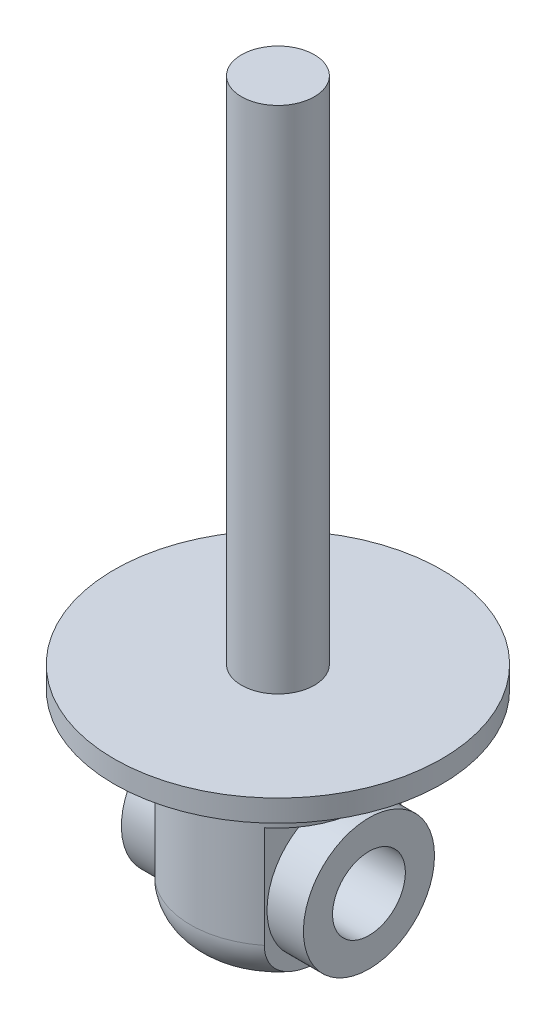
ISO-10303-21;
HEADER;
FILE_DESCRIPTION(('STEP AP214'),'2;1');
FILE_NAME('part.step','',(''),(''),'','','');
FILE_SCHEMA(('AUTOMOTIVE_DESIGN { 1 0 10303 214 1 1 1 1 }'));
ENDSEC;
DATA;
#1=APPLICATION_CONTEXT('core data for automotive mechanical design processes');
#2=APPLICATION_PROTOCOL_DEFINITION('international standard','automotive_design',2000,#1);
#3=PRODUCT_CONTEXT('',#1,'mechanical');
#4=PRODUCT('Part','Part','',(#3));
#5=PRODUCT_RELATED_PRODUCT_CATEGORY('part','',(#4));
#6=PRODUCT_DEFINITION_FORMATION('','',#4);
#7=PRODUCT_DEFINITION_CONTEXT('part definition',#1,'design');
#8=PRODUCT_DEFINITION('design','',#6,#7);
#9=PRODUCT_DEFINITION_SHAPE('','',#8);
#10=(LENGTH_UNIT() NAMED_UNIT(*) SI_UNIT(.MILLI.,.METRE.));
#11=(NAMED_UNIT(*) PLANE_ANGLE_UNIT() SI_UNIT($,.RADIAN.));
#12=(NAMED_UNIT(*) SI_UNIT($,.STERADIAN.) SOLID_ANGLE_UNIT());
#13=UNCERTAINTY_MEASURE_WITH_UNIT(LENGTH_MEASURE(1.E-05),#10,'distance_accuracy_value','');
#14=(GEOMETRIC_REPRESENTATION_CONTEXT(3) GLOBAL_UNCERTAINTY_ASSIGNED_CONTEXT((#13)) GLOBAL_UNIT_ASSIGNED_CONTEXT((#10,
#11,#12)) REPRESENTATION_CONTEXT('',''));
#15=CARTESIAN_POINT('',(0.,0.,0.));
#16=DIRECTION('',(0.,0.,1.));
#17=DIRECTION('',(1.,0.,0.));
#18=AXIS2_PLACEMENT_3D('',#15,#16,#17);
#19=CARTESIAN_POINT('',(-7.5,-8.00000000000001,-22.5));
#20=DIRECTION('',(1.,0.,0.));
#21=DIRECTION('',(0.,1.,0.));
#22=AXIS2_PLACEMENT_3D('',#19,#20,#21);
#23=PLANE('',#22);
#24=CARTESIAN_POINT('',(-7.5,-27.8094750193111,0.));
#25=CARTESIAN_POINT('',(-7.5,-27.8094752958151,0.184521628242419));
#26=CARTESIAN_POINT('',(-7.5,-27.8077270322999,0.369043480287191));
#27=CARTESIAN_POINT('',(-7.5,-27.8006130628877,0.737999394292284));
#28=CARTESIAN_POINT('',(-7.5,-27.7952477367066,0.922433463434384));
#29=CARTESIAN_POINT('',(-7.5,-27.780538513706,1.29122559425462));
#30=CARTESIAN_POINT('',(-7.5,-27.7711929215574,1.47558358999919));
#31=CARTESIAN_POINT('',(-7.5,-27.7479507640883,1.84401846668315));
#32=CARTESIAN_POINT('',(-7.5,-27.734054140347,2.02809534398339));
#33=CARTESIAN_POINT('',(-7.5,-27.701027325669,2.39498843631837));
#34=CARTESIAN_POINT('',(-7.5,-27.6819201299087,2.57780665418326));
#35=CARTESIAN_POINT('',(-7.5,-27.6375682217561,2.94269408038083));
#36=CARTESIAN_POINT('',(-7.5,-27.6123230495969,3.12476323156505));
#37=CARTESIAN_POINT('',(-7.5,-27.5259360262262,3.6691632505479));
#38=CARTESIAN_POINT('',(-7.5,-27.4541196223952,4.02997739530099));
#39=CARTESIAN_POINT('',(-7.5,-27.315114172541,4.57935988961709));
#40=CARTESIAN_POINT('',(-7.5,-27.2608348848703,4.77122256452969));
#41=CARTESIAN_POINT('',(-7.5,-27.1402411036094,5.15109529504942));
#42=CARTESIAN_POINT('',(-7.5,-27.0739312594077,5.33910680786539));
#43=CARTESIAN_POINT('',(-7.5,-26.928148698992,5.70992505463463));
#44=CARTESIAN_POINT('',(-7.5,-26.8486797977089,5.8927332791208));
#45=CARTESIAN_POINT('',(-7.5,-26.6756224712841,6.25155879665883));
#46=CARTESIAN_POINT('',(-7.5,-26.5820364486502,6.42757723883459));
#47=CARTESIAN_POINT('',(-7.5,-26.3958384208508,6.74413785402998));
#48=CARTESIAN_POINT('',(-7.5,-26.3053527427416,6.8859302136676));
#49=CARTESIAN_POINT('',(-7.5,-26.1136422044668,7.16205254122039));
#50=CARTESIAN_POINT('',(-7.5,-26.0124194056704,7.29638393401336));
#51=CARTESIAN_POINT('',(-7.5,-25.7991822855038,7.55627452274061));
#52=CARTESIAN_POINT('',(-7.5,-25.6871652583255,7.6818315054992));
#53=CARTESIAN_POINT('',(-7.5,-25.4525813942248,7.92270374400352));
#54=CARTESIAN_POINT('',(-7.5,-25.3300144777409,8.03801892249803));
#55=CARTESIAN_POINT('',(-7.5,-25.0736714823962,8.25792234562975));
#56=CARTESIAN_POINT('',(-7.5,-24.9398051473305,8.36240569865935));
#57=CARTESIAN_POINT('',(-7.5,-24.662616920615,8.55796576900282));
#58=CARTESIAN_POINT('',(-7.5,-24.5192963548439,8.64904436046083));
#59=CARTESIAN_POINT('',(-7.5,-24.2243409104845,8.81636481076627));
#60=CARTESIAN_POINT('',(-7.5,-24.0727112205184,8.89261579636784));
#61=CARTESIAN_POINT('',(-7.5,-23.7624095052739,9.02909243430965));
#62=CARTESIAN_POINT('',(-7.5,-23.6037388369551,9.08932115899453));
#63=CARTESIAN_POINT('',(-7.5,-23.3052245459151,9.1849514334904));
#64=CARTESIAN_POINT('',(-7.5,-23.1661361294911,9.22272405795734));
#65=CARTESIAN_POINT('',(-7.5,-22.8851087613884,9.28547940350164));
#66=CARTESIAN_POINT('',(-7.5,-22.7431701638949,9.31046370365637));
#67=CARTESIAN_POINT('',(-7.5,-22.4576599589478,9.34730641699016));
#68=CARTESIAN_POINT('',(-7.5,-22.3140890586128,9.35917031033292));
#69=CARTESIAN_POINT('',(-7.5,-22.0264648581988,9.36963164548865));
#70=CARTESIAN_POINT('',(-7.5,-21.8824115750842,9.36822954903948));
#71=CARTESIAN_POINT('',(-7.5,-21.6061914815275,9.35280339576898));
#72=CARTESIAN_POINT('',(-7.5,-21.4739684759154,9.33976569953801));
#73=CARTESIAN_POINT('',(-7.5,-21.2110534946456,9.30256363878721));
#74=CARTESIAN_POINT('',(-7.5,-21.0803620180608,9.27839574533066));
#75=CARTESIAN_POINT('',(-7.5,-20.8215410609612,9.21922065645586));
#76=CARTESIAN_POINT('',(-7.5,-20.6934101253726,9.18421981495561));
#77=CARTESIAN_POINT('',(-7.5,-20.4404340442512,9.10374552536161));
#78=CARTESIAN_POINT('',(-7.5,-20.3155901493276,9.05826815366643));
#79=CARTESIAN_POINT('',(-7.5,-20.0692031015505,8.95699564520569));
#80=CARTESIAN_POINT('',(-7.5,-19.9476868658852,8.90113499399755));
#81=CARTESIAN_POINT('',(-7.5,-19.7094920695403,8.77987692751896));
#82=CARTESIAN_POINT('',(-7.5,-19.5928152563103,8.71447610526943));
#83=CARTESIAN_POINT('',(-7.5,-19.2509911073174,8.50489875856372));
#84=CARTESIAN_POINT('',(-7.5,-19.0339195251877,8.34729299116935));
#85=CARTESIAN_POINT('',(-7.5,-18.609337427954,7.98870608163153));
#86=CARTESIAN_POINT('',(-7.5,-18.4039002281567,7.78529755950602));
#87=CARTESIAN_POINT('',(-7.5,-18.0246758733926,7.35109040646743));
#88=CARTESIAN_POINT('',(-7.5,-17.8508837047537,7.12029612399675));
#89=CARTESIAN_POINT('',(-7.5,-17.5744409595824,6.69864287979116));
#90=CARTESIAN_POINT('',(-7.5,-17.4648689537028,6.51223410047274));
#91=CARTESIAN_POINT('',(-7.5,-17.2626904112623,6.13034538679087));
#92=CARTESIAN_POINT('',(-7.5,-17.1700919878543,5.93486117014359));
#93=CARTESIAN_POINT('',(-7.5,-17.0006313082269,5.53658641063458));
#94=CARTESIAN_POINT('',(-7.5,-16.9238147555949,5.33377659321381));
#95=CARTESIAN_POINT('',(-7.5,-16.784875362625,4.92331428460811));
#96=CARTESIAN_POINT('',(-7.5,-16.7227484430634,4.71566315546475));
#97=CARTESIAN_POINT('',(-7.5,-16.5386673542946,4.02250667384636));
#98=CARTESIAN_POINT('',(-7.5,-16.4449803111871,3.52942656369883));
#99=CARTESIAN_POINT('',(-7.5,-16.3412352530644,2.78498720051468));
#100=CARTESIAN_POINT('',(-7.5,-16.3127705467372,2.53568557770052));
#101=CARTESIAN_POINT('',(-7.5,-16.2658269581612,2.03612434937441));
#102=CARTESIAN_POINT('',(-7.5,-16.2473468655649,1.78586486368144));
#103=CARTESIAN_POINT('',(-7.5,-16.2184283009414,1.28363112408655));
#104=CARTESIAN_POINT('',(-7.5,-16.208031590786,1.03165466176094));
#105=CARTESIAN_POINT('',(-7.5,-16.1941849220444,0.527501194688707));
#106=CARTESIAN_POINT('',(-7.5,-16.1907352988047,0.27532418084894));
#107=CARTESIAN_POINT('',(-7.5,-16.1903333462322,-0.228731345602945));
#108=CARTESIAN_POINT('',(-7.5,-16.193373232494,-0.480609853630143));
#109=CARTESIAN_POINT('',(-7.5,-16.2063332691715,-0.984173581494234));
#110=CARTESIAN_POINT('',(-7.5,-16.2162528039696,-1.2358588166087));
#111=CARTESIAN_POINT('',(-7.5,-16.2454935008677,-1.7627882566893));
#112=CARTESIAN_POINT('',(-7.5,-16.2656211327378,-2.03798990109168));
#113=CARTESIAN_POINT('',(-7.5,-16.3180418431017,-2.58731345976836));
#114=CARTESIAN_POINT('',(-7.5,-16.3503365349836,-2.86143522597441));
#115=CARTESIAN_POINT('',(-7.5,-16.4300545548583,-3.40623279358435));
#116=CARTESIAN_POINT('',(-7.5,-16.4774071358833,-3.67691867401872));
#117=CARTESIAN_POINT('',(-7.5,-16.5907053400646,-4.2143947607995));
#118=CARTESIAN_POINT('',(-7.5,-16.6566449229111,-4.4811862031647));
#119=CARTESIAN_POINT('',(-7.5,-16.7911834026755,-4.94217748017442));
#120=CARTESIAN_POINT('',(-7.5,-16.8549558474619,-5.13778160857807));
#121=CARTESIAN_POINT('',(-7.5,-16.9961265709521,-5.52399422741739));
#122=CARTESIAN_POINT('',(-7.5,-17.0735207892669,-5.71460418712136));
#123=CARTESIAN_POINT('',(-7.5,-17.2430793617625,-6.08921987221889));
#124=CARTESIAN_POINT('',(-7.5,-17.3352463319138,-6.27322442084438));
#125=CARTESIAN_POINT('',(-7.5,-17.5351759469553,-6.63256976145457));
#126=CARTESIAN_POINT('',(-7.5,-17.6429345063483,-6.80791280693597));
#127=CARTESIAN_POINT('',(-7.5,-17.8487615005736,-7.10989658300673));
#128=CARTESIAN_POINT('',(-7.5,-17.9436617626469,-7.23870103997639));
#129=CARTESIAN_POINT('',(-7.5,-18.143229826346,-7.48856622066219));
#130=CARTESIAN_POINT('',(-7.5,-18.2478987883735,-7.60962602152204));
#131=CARTESIAN_POINT('',(-7.5,-18.4668045949393,-7.84271387792474));
#132=CARTESIAN_POINT('',(-7.5,-18.5810384459287,-7.95474473789612));
#133=CARTESIAN_POINT('',(-7.5,-18.8187268203134,-8.16854933672494));
#134=CARTESIAN_POINT('',(-7.5,-18.9421800591116,-8.27032449994957));
#135=CARTESIAN_POINT('',(-7.5,-19.1987356397018,-8.46313596223061));
#136=CARTESIAN_POINT('',(-7.5,-19.3319055781875,-8.55408255407202));
#137=CARTESIAN_POINT('',(-7.5,-19.6061418402457,-8.72304401015934));
#138=CARTESIAN_POINT('',(-7.5,-19.747204378254,-8.80106500403696));
#139=CARTESIAN_POINT('',(-7.5,-20.0362068877473,-8.94309470867639));
#140=CARTESIAN_POINT('',(-7.5,-20.1841460034049,-9.00710515749598));
#141=CARTESIAN_POINT('',(-7.5,-20.4856380297523,-9.12014361193693));
#142=CARTESIAN_POINT('',(-7.5,-20.6391901444676,-9.16917373274798));
#143=CARTESIAN_POINT('',(-7.5,-20.9313639562727,-9.24643392787081));
#144=CARTESIAN_POINT('',(-7.5,-21.0695088202567,-9.2764768563288));
#145=CARTESIAN_POINT('',(-7.5,-21.3479315795213,-9.32406143536891));
#146=CARTESIAN_POINT('',(-7.5,-21.4882092809527,-9.34160421520928));
#147=CARTESIAN_POINT('',(-7.5,-21.769719609589,-9.36396002322678));
#148=CARTESIAN_POINT('',(-7.5,-21.9109518422674,-9.36877802253041));
#149=CARTESIAN_POINT('',(-7.5,-22.1932734390957,-9.36563613906261));
#150=CARTESIAN_POINT('',(-7.5,-22.3343628067459,-9.35767657732182));
#151=CARTESIAN_POINT('',(-7.5,-22.6064011749062,-9.32998563551062));
#152=CARTESIAN_POINT('',(-7.5,-22.7374295539783,-9.31102660205279));
#153=CARTESIAN_POINT('',(-7.5,-22.9974780227225,-9.26218788836622));
#154=CARTESIAN_POINT('',(-7.5,-23.1264974548056,-9.23230470755187));
#155=CARTESIAN_POINT('',(-7.5,-23.3815508516768,-9.16196479385525));
#156=CARTESIAN_POINT('',(-7.5,-23.5075862018084,-9.12151307666088));
#157=CARTESIAN_POINT('',(-7.5,-23.7559772755244,-9.03044888037393));
#158=CARTESIAN_POINT('',(-7.5,-23.8783315975104,-8.97983258590814));
#159=CARTESIAN_POINT('',(-7.5,-24.1205569584555,-8.8680617574251));
#160=CARTESIAN_POINT('',(-7.5,-24.2403549182387,-8.80674877020291));
#161=CARTESIAN_POINT('',(-7.5,-24.4747211723639,-8.67480187441993));
#162=CARTESIAN_POINT('',(-7.5,-24.5892875713423,-8.60416462323317));
#163=CARTESIAN_POINT('',(-7.5,-24.9242270275788,-8.37928997825773));
#164=CARTESIAN_POINT('',(-7.5,-25.13600210755,-8.21201407264852));
#165=CARTESIAN_POINT('',(-7.5,-25.5504485361803,-7.832942739178));
#166=CARTESIAN_POINT('',(-7.5,-25.7507010772538,-7.618532285847));
#167=CARTESIAN_POINT('',(-7.5,-26.1185076671662,-7.16337882817299));
#168=CARTESIAN_POINT('',(-7.5,-26.2860513710234,-6.9226275303298));
#169=CARTESIAN_POINT('',(-7.5,-26.5545024709803,-6.4788664395953));
#170=CARTESIAN_POINT('',(-7.5,-26.6619013252763,-6.279707295078));
#171=CARTESIAN_POINT('',(-7.5,-26.858559219587,-5.87254463104013));
#172=CARTESIAN_POINT('',(-7.5,-26.9478095430477,-5.66453691936402));
#173=CARTESIAN_POINT('',(-7.5,-27.1096214973705,-5.24180758530233));
#174=CARTESIAN_POINT('',(-7.5,-27.1821555960046,-5.02707553901332));
#175=CARTESIAN_POINT('',(-7.5,-27.3121001369762,-4.59305326757356));
#176=CARTESIAN_POINT('',(-7.5,-27.3695048137837,-4.37376133898657));
#177=CARTESIAN_POINT('',(-7.5,-27.4981886749365,-3.81417726059937));
#178=CARTESIAN_POINT('',(-7.5,-27.5604951716191,-3.47183296905169));
#179=CARTESIAN_POINT('',(-7.5,-27.6609019684328,-2.78359200614869));
#180=CARTESIAN_POINT('',(-7.5,-27.6989863972919,-2.43769315620305));
#181=CARTESIAN_POINT('',(-7.5,-27.7425563308733,-1.91723181279188));
#182=CARTESIAN_POINT('',(-7.5,-27.7548291128016,-1.74318957751326));
#183=CARTESIAN_POINT('',(-7.5,-27.7753986995787,-1.39487161182967));
#184=CARTESIAN_POINT('',(-7.5,-27.7836956019396,-1.22059588725638));
#185=CARTESIAN_POINT('',(-7.5,-27.796777523185,-0.87196539298604));
#186=CARTESIAN_POINT('',(-7.5,-27.8015635129394,-0.697610658492171));
#187=CARTESIAN_POINT('',(-7.5,-27.8079121855994,-0.348837350643893));
#188=CARTESIAN_POINT('',(-7.5,-27.8094747579462,-0.174418775305038));
#189=CARTESIAN_POINT('',(-7.5,-27.8094750193111,0.));
#190=B_SPLINE_CURVE_WITH_KNOTS('',3,(#24,#25,#26,#27,#28,#29,#30,#31,#32,#33,#34,#35,#36,#37,
#38,#39,#40,#41,#42,#43,#44,#45,#46,#47,#48,#49,#50,#51,#52,#53,#54,#55,#56,#57,#58,#59,#60,#61,
#62,#63,#64,#65,#66,#67,#68,#69,#70,#71,#72,#73,#74,#75,#76,#77,#78,#79,#80,#81,#82,#83,#84,#85,
#86,#87,#88,#89,#90,#91,#92,#93,#94,#95,#96,#97,#98,#99,#100,#101,#102,#103,#104,#105,#106,#107,
#108,#109,#110,#111,#112,#113,#114,#115,#116,#117,#118,#119,#120,#121,#122,#123,#124,#125,#126,
#127,#128,#129,#130,#131,#132,#133,#134,#135,#136,#137,#138,#139,#140,#141,#142,#143,#144,#145,
#146,#147,#148,#149,#150,#151,#152,#153,#154,#155,#156,#157,#158,#159,#160,#161,#162,#163,#164,
#165,#166,#167,#168,#169,#170,#171,#172,#173,#174,#175,#176,#177,#178,#179,#180,#181,#182,#183,
#184,#185,#186,#187,#188,#189),.UNSPECIFIED.,.T.,.F.,(4,2,2,2,2,2,2,2,2,2,2,2,2,2,2,2,2,2,2,2,2,
2,2,2,2,2,2,2,2,2,2,2,2,2,2,2,2,2,2,2,2,2,2,2,2,2,2,2,2,2,2,2,2,2,2,2,2,2,2,2,2,2,2,2,2,2,2,2,2,
2,2,2,2,2,2,2,2,2,2,2,2,2,4),(0.,0.553556541747908,1.10705498067111,1.6607894093517,
2.21453094651203,2.76586720349669,3.31724477121585,4.41912680182766,5.01698525599297,
5.61461314908642,6.21206808675634,6.80942146164093,7.31357153503217,7.81762499361292,
8.32180513447661,8.82598907791493,9.33467160980088,9.84328295415676,10.3515802378956,
10.8597799828438,11.291588037567,11.7233427606026,12.1549170790764,12.5864763761706,
12.9845986570771,13.3828472534997,13.7808627038906,14.1790274594521,14.579795450788,
14.9807069160888,15.7821103743006,16.6461503316802,17.5100532757815,18.1578732554314,
18.8060020817716,19.4559821948788,20.1057815998326,21.6069748462105,22.3596793389022,
23.1122925673175,23.8687687149109,24.6252813779039,25.3808870860738,26.1364251884592,
26.9640249034877,27.7917343993232,28.6156111127982,29.4392203950451,30.0559954213971,
30.6725869093732,31.2892877047367,31.9058271963482,32.3853559200308,32.8649416785199,
33.3443778968313,33.823747436381,34.3068464150843,34.7897156366604,35.2725249226045,
35.7552660053908,36.1788379642465,36.6023716529343,37.0257398573389,37.4490974249689,
37.8458122806135,38.2426543730445,38.639308470493,39.0361117351622,39.4393886143668,
39.8428104576492,40.6491243408277,41.5260051520067,42.403162850804,43.0810551134699,
43.7592721958252,44.4385984678268,45.1181832448309,46.1608437011148,47.2041866484774,
47.7275747628343,48.2509500399341,48.7741805338585,49.2974289735857),.UNSPECIFIED.);
#191=CARTESIAN_POINT('',(-7.5,-22.,-9.3674969975976));
#192=VERTEX_POINT('',#191);
#193=CARTESIAN_POINT('',(-7.5,-21.9999999999999,9.36749699759766));
#194=VERTEX_POINT('',#193);
#195=EDGE_CURVE('E126',#192,#194,#190,.T.);
#196=ORIENTED_EDGE('',*,*,#195,.T.);
#197=DIRECTION('',(0.,1.,0.));
#198=VECTOR('',#197,1.);
#199=CARTESIAN_POINT('',(-7.49999999999999,-28.,9.3674969975976));
#200=LINE('',#199,#198);
#201=CARTESIAN_POINT('',(-7.5,-8.00000000000001,9.36749699759759));
#202=VERTEX_POINT('',#201);
#203=EDGE_CURVE('E89',#202,#194,#200,.F.);
#204=ORIENTED_EDGE('',*,*,#203,.F.);
#205=DIRECTION('',(0.,0.,1.));
#206=VECTOR('',#205,1.);
#207=CARTESIAN_POINT('',(-7.5,-8.00000000000001,-22.5));
#208=LINE('',#207,#206);
#209=CARTESIAN_POINT('',(-7.5,-8.00000000000001,-9.36749699759761));
#210=VERTEX_POINT('',#209);
#211=EDGE_CURVE('E82',#210,#202,#208,.T.);
#212=ORIENTED_EDGE('',*,*,#211,.F.);
#213=DIRECTION('',(0.,1.,0.));
#214=VECTOR('',#213,1.);
#215=CARTESIAN_POINT('',(-7.49999999999999,-28.,-9.3674969975976));
#216=LINE('',#215,#214);
#217=EDGE_CURVE('E60',#192,#210,#216,.T.);
#218=ORIENTED_EDGE('',*,*,#217,.F.);
#219=EDGE_LOOP('',(#196,#204,#212,#218));
#220=FACE_BOUND('',#219,.T.);
#221=CARTESIAN_POINT('',(-7.5,-18.,0.));
#222=DIRECTION('',(1.,0.,0.));
#223=DIRECTION('',(0.,1.,0.));
#224=AXIS2_PLACEMENT_3D('',#221,#222,#223);
#225=CIRCLE('',#224,9.);
#226=CARTESIAN_POINT('',(-7.5,-9.,0.));
#227=VERTEX_POINT('',#226);
#228=EDGE_CURVE('E11',#227,#227,#225,.F.);
#229=ORIENTED_EDGE('',*,*,#228,.F.);
#230=EDGE_LOOP('',(#229));
#231=FACE_BOUND('',#230,.T.);
#232=ADVANCED_FACE('F35',(#220,#231),#23,.F.);
#233=CARTESIAN_POINT('',(7.5,-8.00000000000001,-22.5));
#234=DIRECTION('',(-1.,0.,0.));
#235=DIRECTION('',(0.,-1.,0.));
#236=AXIS2_PLACEMENT_3D('',#233,#234,#235);
#237=PLANE('',#236);
#238=CARTESIAN_POINT('',(7.5,-27.8094750193111,0.));
#239=CARTESIAN_POINT('',(7.5,-27.8094752958151,-0.18452162824242));
#240=CARTESIAN_POINT('',(7.5,-27.8077270322999,-0.369043480287192));
#241=CARTESIAN_POINT('',(7.5,-27.8006130628877,-0.737999394292286));
#242=CARTESIAN_POINT('',(7.5,-27.7952477367066,-0.922433463434386));
#243=CARTESIAN_POINT('',(7.5,-27.780538513706,-1.29122559425462));
#244=CARTESIAN_POINT('',(7.5,-27.7711929215574,-1.47558358999919));
#245=CARTESIAN_POINT('',(7.5,-27.7479507640883,-1.84401846668315));
#246=CARTESIAN_POINT('',(7.5,-27.734054140347,-2.0280953439834));
#247=CARTESIAN_POINT('',(7.5,-27.701027325669,-2.39498843631837));
#248=CARTESIAN_POINT('',(7.5,-27.6819201299087,-2.57780665418327));
#249=CARTESIAN_POINT('',(7.5,-27.6375682217561,-2.94269408038084));
#250=CARTESIAN_POINT('',(7.5,-27.6123230495969,-3.12476323156505));
#251=CARTESIAN_POINT('',(7.5,-27.5259360262262,-3.6691632505479));
#252=CARTESIAN_POINT('',(7.5,-27.4541196223952,-4.029977395301));
#253=CARTESIAN_POINT('',(7.5,-27.315114172541,-4.57935988961709));
#254=CARTESIAN_POINT('',(7.5,-27.2608348848703,-4.7712225645297));
#255=CARTESIAN_POINT('',(7.5,-27.1402411036094,-5.15109529504943));
#256=CARTESIAN_POINT('',(7.5,-27.0739312594077,-5.3391068078654));
#257=CARTESIAN_POINT('',(7.5,-26.9281486989919,-5.70992505463464));
#258=CARTESIAN_POINT('',(7.5,-26.8486797977089,-5.8927332791208));
#259=CARTESIAN_POINT('',(7.5,-26.6756224712841,-6.25155879665883));
#260=CARTESIAN_POINT('',(7.5,-26.5820364486501,-6.4275772388346));
#261=CARTESIAN_POINT('',(7.5,-26.3958384208508,-6.74413785402998));
#262=CARTESIAN_POINT('',(7.5,-26.3053527427416,-6.8859302136676));
#263=CARTESIAN_POINT('',(7.5,-26.1136422044668,-7.16205254122039));
#264=CARTESIAN_POINT('',(7.5,-26.0124194056704,-7.29638393401336));
#265=CARTESIAN_POINT('',(7.5,-25.7991822855038,-7.55627452274061));
#266=CARTESIAN_POINT('',(7.5,-25.6871652583255,-7.6818315054992));
#267=CARTESIAN_POINT('',(7.5,-25.4525813942248,-7.92270374400352));
#268=CARTESIAN_POINT('',(7.5,-25.3300144777409,-8.03801892249802));
#269=CARTESIAN_POINT('',(7.5,-25.0736714823962,-8.25792234562975));
#270=CARTESIAN_POINT('',(7.5,-24.9398051473305,-8.36240569865935));
#271=CARTESIAN_POINT('',(7.5,-24.662616920615,-8.55796576900281));
#272=CARTESIAN_POINT('',(7.5,-24.5192963548439,-8.64904436046082));
#273=CARTESIAN_POINT('',(7.5,-24.2243409104845,-8.81636481076626));
#274=CARTESIAN_POINT('',(7.5,-24.0727112205184,-8.89261579636783));
#275=CARTESIAN_POINT('',(7.5,-23.7624095052739,-9.02909243430965));
#276=CARTESIAN_POINT('',(7.5,-23.6037388369551,-9.08932115899453));
#277=CARTESIAN_POINT('',(7.5,-23.3052245459151,-9.1849514334904));
#278=CARTESIAN_POINT('',(7.5,-23.1661361294911,-9.22272405795733));
#279=CARTESIAN_POINT('',(7.5,-22.8851087613884,-9.28547940350163));
#280=CARTESIAN_POINT('',(7.5,-22.7431701638949,-9.31046370365637));
#281=CARTESIAN_POINT('',(7.5,-22.4576599589478,-9.34730641699015));
#282=CARTESIAN_POINT('',(7.5,-22.3140890586128,-9.35917031033292));
#283=CARTESIAN_POINT('',(7.5,-22.0264648581988,-9.36963164548865));
#284=CARTESIAN_POINT('',(7.5,-21.8824115750842,-9.36822954903947));
#285=CARTESIAN_POINT('',(7.5,-21.6061914815275,-9.35280339576898));
#286=CARTESIAN_POINT('',(7.5,-21.4739684759153,-9.33976569953801));
#287=CARTESIAN_POINT('',(7.5,-21.2110534946456,-9.3025636387872));
#288=CARTESIAN_POINT('',(7.5,-21.0803620180608,-9.27839574533065));
#289=CARTESIAN_POINT('',(7.5,-20.8215410609612,-9.21922065645586));
#290=CARTESIAN_POINT('',(7.5,-20.6934101253726,-9.1842198149556));
#291=CARTESIAN_POINT('',(7.5,-20.4404340442512,-9.1037455253616));
#292=CARTESIAN_POINT('',(7.5,-20.3155901493276,-9.05826815366643));
#293=CARTESIAN_POINT('',(7.5,-20.0692031015505,-8.95699564520569));
#294=CARTESIAN_POINT('',(7.5,-19.9476868658852,-8.90113499399755));
#295=CARTESIAN_POINT('',(7.5,-19.7094920695403,-8.77987692751896));
#296=CARTESIAN_POINT('',(7.5,-19.5928152563103,-8.71447610526943));
#297=CARTESIAN_POINT('',(7.5,-19.2509911073174,-8.50489875856371));
#298=CARTESIAN_POINT('',(7.5,-19.0339195251877,-8.34729299116934));
#299=CARTESIAN_POINT('',(7.5,-18.609337427954,-7.98870608163152));
#300=CARTESIAN_POINT('',(7.5,-18.4039002281567,-7.78529755950601));
#301=CARTESIAN_POINT('',(7.5,-18.0246758733926,-7.35109040646742));
#302=CARTESIAN_POINT('',(7.5,-17.8508837047537,-7.12029612399674));
#303=CARTESIAN_POINT('',(7.5,-17.5744409595824,-6.69864287979115));
#304=CARTESIAN_POINT('',(7.5,-17.4648689537028,-6.51223410047273));
#305=CARTESIAN_POINT('',(7.5,-17.2626904112623,-6.13034538679086));
#306=CARTESIAN_POINT('',(7.5,-17.1700919878543,-5.93486117014358));
#307=CARTESIAN_POINT('',(7.5,-17.0006313082269,-5.53658641063457));
#308=CARTESIAN_POINT('',(7.5,-16.9238147555949,-5.3337765932138));
#309=CARTESIAN_POINT('',(7.5,-16.784875362625,-4.9233142846081));
#310=CARTESIAN_POINT('',(7.5,-16.7227484430634,-4.71566315546474));
#311=CARTESIAN_POINT('',(7.5,-16.5386673542946,-4.02250667384636));
#312=CARTESIAN_POINT('',(7.5,-16.4449803111871,-3.52942656369882));
#313=CARTESIAN_POINT('',(7.5,-16.3412352530644,-2.78498720051467));
#314=CARTESIAN_POINT('',(7.5,-16.3127705467372,-2.53568557770051));
#315=CARTESIAN_POINT('',(7.5,-16.2658269581612,-2.0361243493744));
#316=CARTESIAN_POINT('',(7.5,-16.2473468655649,-1.78586486368143));
#317=CARTESIAN_POINT('',(7.5,-16.2184283009414,-1.28363112408654));
#318=CARTESIAN_POINT('',(7.5,-16.208031590786,-1.03165466176093));
#319=CARTESIAN_POINT('',(7.5,-16.1941849220444,-0.5275011946887));
#320=CARTESIAN_POINT('',(7.5,-16.1907352988047,-0.275324180848932));
#321=CARTESIAN_POINT('',(7.5,-16.1903333462322,0.228731345602954));
#322=CARTESIAN_POINT('',(7.5,-16.193373232494,0.480609853630152));
#323=CARTESIAN_POINT('',(7.5,-16.2063332691715,0.984173581494243));
#324=CARTESIAN_POINT('',(7.5,-16.2162528039696,1.23585881660871));
#325=CARTESIAN_POINT('',(7.5,-16.2454935008677,1.76278825668931));
#326=CARTESIAN_POINT('',(7.5,-16.2656211327378,2.03798990109169));
#327=CARTESIAN_POINT('',(7.5,-16.3180418431017,2.58731345976837));
#328=CARTESIAN_POINT('',(7.5,-16.3503365349836,2.86143522597442));
#329=CARTESIAN_POINT('',(7.5,-16.4300545548583,3.40623279358436));
#330=CARTESIAN_POINT('',(7.5,-16.4774071358833,3.67691867401872));
#331=CARTESIAN_POINT('',(7.5,-16.5907053400646,4.21439476079951));
#332=CARTESIAN_POINT('',(7.5,-16.6566449229111,4.48118620316469));
#333=CARTESIAN_POINT('',(7.5,-16.7911834026755,4.94217748017442));
#334=CARTESIAN_POINT('',(7.5,-16.8549558474619,5.13778160857806));
#335=CARTESIAN_POINT('',(7.5,-16.9961265709521,5.52399422741739));
#336=CARTESIAN_POINT('',(7.5,-17.0735207892669,5.71460418712136));
#337=CARTESIAN_POINT('',(7.5,-17.2430793617625,6.08921987221889));
#338=CARTESIAN_POINT('',(7.5,-17.3352463319138,6.27322442084438));
#339=CARTESIAN_POINT('',(7.5,-17.5351759469553,6.63256976145456));
#340=CARTESIAN_POINT('',(7.5,-17.6429345063483,6.80791280693597));
#341=CARTESIAN_POINT('',(7.5,-17.8487615005736,7.10989658300674));
#342=CARTESIAN_POINT('',(7.5,-17.9436617626469,7.23870103997639));
#343=CARTESIAN_POINT('',(7.5,-18.143229826346,7.48856622066219));
#344=CARTESIAN_POINT('',(7.5,-18.2478987883735,7.60962602152205));
#345=CARTESIAN_POINT('',(7.5,-18.4668045949393,7.84271387792474));
#346=CARTESIAN_POINT('',(7.5,-18.5810384459287,7.95474473789612));
#347=CARTESIAN_POINT('',(7.5,-18.8187268203134,8.16854933672494));
#348=CARTESIAN_POINT('',(7.5,-18.9421800591116,8.27032449994956));
#349=CARTESIAN_POINT('',(7.5,-19.1987356397018,8.46313596223061));
#350=CARTESIAN_POINT('',(7.5,-19.3319055781875,8.55408255407202));
#351=CARTESIAN_POINT('',(7.5,-19.6061418402457,8.72304401015933));
#352=CARTESIAN_POINT('',(7.5,-19.747204378254,8.80106500403696));
#353=CARTESIAN_POINT('',(7.5,-20.0362068877473,8.94309470867638));
#354=CARTESIAN_POINT('',(7.5,-20.1841460034049,9.00710515749598));
#355=CARTESIAN_POINT('',(7.5,-20.4856380297523,9.12014361193692));
#356=CARTESIAN_POINT('',(7.5,-20.6391901444676,9.16917373274798));
#357=CARTESIAN_POINT('',(7.5,-20.9313639562727,9.24643392787081));
#358=CARTESIAN_POINT('',(7.5,-21.0695088202567,9.27647685632879));
#359=CARTESIAN_POINT('',(7.5,-21.3479315795213,9.32406143536891));
#360=CARTESIAN_POINT('',(7.5,-21.4882092809527,9.34160421520928));
#361=CARTESIAN_POINT('',(7.5,-21.769719609589,9.36396002322678));
#362=CARTESIAN_POINT('',(7.5,-21.9109518422674,9.36877802253041));
#363=CARTESIAN_POINT('',(7.5,-22.1932734390957,9.36563613906261));
#364=CARTESIAN_POINT('',(7.5,-22.3343628067459,9.35767657732182));
#365=CARTESIAN_POINT('',(7.5,-22.6064011749062,9.32998563551062));
#366=CARTESIAN_POINT('',(7.5,-22.7374295539783,9.31102660205278));
#367=CARTESIAN_POINT('',(7.5,-22.9974780227225,9.26218788836621));
#368=CARTESIAN_POINT('',(7.5,-23.1264974548056,9.23230470755187));
#369=CARTESIAN_POINT('',(7.5,-23.3815508516768,9.16196479385525));
#370=CARTESIAN_POINT('',(7.5,-23.5075862018084,9.12151307666088));
#371=CARTESIAN_POINT('',(7.5,-23.7559772755244,9.03044888037392));
#372=CARTESIAN_POINT('',(7.5,-23.8783315975104,8.97983258590813));
#373=CARTESIAN_POINT('',(7.5,-24.1205569584555,8.86806175742509));
#374=CARTESIAN_POINT('',(7.5,-24.2403549182387,8.8067487702029));
#375=CARTESIAN_POINT('',(7.5,-24.4747211723639,8.67480187441993));
#376=CARTESIAN_POINT('',(7.5,-24.5892875713423,8.60416462323317));
#377=CARTESIAN_POINT('',(7.5,-24.9242270275788,8.37928997825773));
#378=CARTESIAN_POINT('',(7.5,-25.13600210755,8.21201407264852));
#379=CARTESIAN_POINT('',(7.5,-25.5504485361803,7.832942739178));
#380=CARTESIAN_POINT('',(7.5,-25.7507010772538,7.61853228584699));
#381=CARTESIAN_POINT('',(7.5,-26.1185076671662,7.16337882817298));
#382=CARTESIAN_POINT('',(7.5,-26.2860513710234,6.92262753032979));
#383=CARTESIAN_POINT('',(7.5,-26.5545024709803,6.4788664395953));
#384=CARTESIAN_POINT('',(7.5,-26.6619013252763,6.27970729507799));
#385=CARTESIAN_POINT('',(7.5,-26.858559219587,5.87254463104012));
#386=CARTESIAN_POINT('',(7.5,-26.9478095430477,5.66453691936401));
#387=CARTESIAN_POINT('',(7.5,-27.1096214973705,5.24180758530232));
#388=CARTESIAN_POINT('',(7.5,-27.1821555960046,5.02707553901331));
#389=CARTESIAN_POINT('',(7.5,-27.3121001369762,4.59305326757356));
#390=CARTESIAN_POINT('',(7.5,-27.3695048137837,4.37376133898656));
#391=CARTESIAN_POINT('',(7.5,-27.4981886749365,3.81417726059937));
#392=CARTESIAN_POINT('',(7.5,-27.5604951716191,3.47183296905169));
#393=CARTESIAN_POINT('',(7.5,-27.6609019684328,2.78359200614869));
#394=CARTESIAN_POINT('',(7.5,-27.6989863972919,2.43769315620305));
#395=CARTESIAN_POINT('',(7.5,-27.7425563308733,1.91723181279187));
#396=CARTESIAN_POINT('',(7.5,-27.7548291128016,1.74318957751326));
#397=CARTESIAN_POINT('',(7.5,-27.7753986995787,1.39487161182967));
#398=CARTESIAN_POINT('',(7.5,-27.7836956019396,1.22059588725638));
#399=CARTESIAN_POINT('',(7.5,-27.796777523185,0.871965392986041));
#400=CARTESIAN_POINT('',(7.5,-27.8015635129394,0.697610658492171));
#401=CARTESIAN_POINT('',(7.5,-27.8079121855994,0.348837350643893));
#402=CARTESIAN_POINT('',(7.5,-27.8094747579462,0.174418775305038));
#403=CARTESIAN_POINT('',(7.5,-27.8094750193111,0.));
#404=B_SPLINE_CURVE_WITH_KNOTS('',3,(#238,#239,#240,#241,#242,#243,#244,#245,#246,#247,#248,
#249,#250,#251,#252,#253,#254,#255,#256,#257,#258,#259,#260,#261,#262,#263,#264,#265,#266,#267,
#268,#269,#270,#271,#272,#273,#274,#275,#276,#277,#278,#279,#280,#281,#282,#283,#284,#285,#286,
#287,#288,#289,#290,#291,#292,#293,#294,#295,#296,#297,#298,#299,#300,#301,#302,#303,#304,#305,
#306,#307,#308,#309,#310,#311,#312,#313,#314,#315,#316,#317,#318,#319,#320,#321,#322,#323,#324,
#325,#326,#327,#328,#329,#330,#331,#332,#333,#334,#335,#336,#337,#338,#339,#340,#341,#342,#343,
#344,#345,#346,#347,#348,#349,#350,#351,#352,#353,#354,#355,#356,#357,#358,#359,#360,#361,#362,
#363,#364,#365,#366,#367,#368,#369,#370,#371,#372,#373,#374,#375,#376,#377,#378,#379,#380,#381,
#382,#383,#384,#385,#386,#387,#388,#389,#390,#391,#392,#393,#394,#395,#396,#397,#398,#399,#400,
#401,#402,#403),.UNSPECIFIED.,.T.,.F.,(4,2,2,2,2,2,2,2,2,2,2,2,2,2,2,2,2,2,2,2,2,2,2,2,2,2,2,2,
2,2,2,2,2,2,2,2,2,2,2,2,2,2,2,2,2,2,2,2,2,2,2,2,2,2,2,2,2,2,2,2,2,2,2,2,2,2,2,2,2,2,2,2,2,2,2,2,
2,2,2,2,2,2,4),(0.,0.553556541747909,1.10705498067111,1.66078940935171,2.21453094651203,
2.7658672034967,3.31724477121586,4.41912680182767,5.01698525599298,5.61461314908643,
6.21206808675635,6.80942146164093,7.31357153503217,7.81762499361292,8.32180513447662,
8.82598907791493,9.33467160980088,9.84328295415676,10.3515802378956,10.8597799828438,
11.291588037567,11.7233427606026,12.1549170790764,12.5864763761706,12.9845986570771,
13.3828472534997,13.7808627038906,14.1790274594521,14.579795450788,14.9807069160888,
15.7821103743006,16.6461503316802,17.5100532757815,18.1578732554314,18.8060020817716,
19.4559821948789,20.1057815998326,21.6069748462105,22.3596793389022,23.1122925673176,
23.8687687149109,24.6252813779039,25.3808870860738,26.1364251884592,26.9640249034878,
27.7917343993232,28.6156111127982,29.4392203950451,30.0559954213971,30.6725869093732,
31.2892877047367,31.9058271963482,32.3853559200308,32.8649416785199,33.3443778968313,
33.823747436381,34.3068464150843,34.7897156366603,35.2725249226045,35.7552660053908,
36.1788379642464,36.6023716529342,37.0257398573389,37.4490974249688,37.8458122806135,
38.2426543730445,38.6393084704929,39.0361117351622,39.4393886143667,39.8428104576491,
40.6491243408276,41.5260051520067,42.4031628508039,43.0810551134699,43.7592721958252,
44.4385984678267,45.1181832448308,46.1608437011148,47.2041866484774,47.7275747628343,
48.2509500399341,48.7741805338585,49.2974289735857),.UNSPECIFIED.);
#405=CARTESIAN_POINT('',(7.5,-22.,9.3674969975976));
#406=VERTEX_POINT('',#405);
#407=CARTESIAN_POINT('',(7.5,-21.9999999999999,-9.36749699759765));
#408=VERTEX_POINT('',#407);
#409=EDGE_CURVE('E86',#406,#408,#404,.T.);
#410=ORIENTED_EDGE('',*,*,#409,.T.);
#411=DIRECTION('',(0.,1.,0.));
#412=VECTOR('',#411,1.);
#413=CARTESIAN_POINT('',(7.5,-28.,-9.3674969975976));
#414=LINE('',#413,#412);
#415=CARTESIAN_POINT('',(7.5,-8.00000000000001,-9.3674969975976));
#416=VERTEX_POINT('',#415);
#417=EDGE_CURVE('E100',#416,#408,#414,.F.);
#418=ORIENTED_EDGE('',*,*,#417,.F.);
#419=DIRECTION('',(0.,0.,1.));
#420=VECTOR('',#419,1.);
#421=CARTESIAN_POINT('',(7.5,-8.00000000000001,-22.5));
#422=LINE('',#421,#420);
#423=CARTESIAN_POINT('',(7.5,-8.00000000000001,9.3674969975976));
#424=VERTEX_POINT('',#423);
#425=EDGE_CURVE('E90',#416,#424,#422,.T.);
#426=ORIENTED_EDGE('',*,*,#425,.T.);
#427=DIRECTION('',(0.,1.,0.));
#428=VECTOR('',#427,1.);
#429=CARTESIAN_POINT('',(7.5,-28.,9.3674969975976));
#430=LINE('',#429,#428);
#431=EDGE_CURVE('E52',#406,#424,#430,.T.);
#432=ORIENTED_EDGE('',*,*,#431,.F.);
#433=EDGE_LOOP('',(#410,#418,#426,#432));
#434=FACE_BOUND('',#433,.T.);
#435=CARTESIAN_POINT('',(7.5,-18.,0.));
#436=DIRECTION('',(-1.,0.,0.));
#437=DIRECTION('',(0.,-1.,0.));
#438=AXIS2_PLACEMENT_3D('',#435,#436,#437);
#439=CIRCLE('',#438,9.);
#440=CARTESIAN_POINT('',(7.5,-27.,0.));
#441=VERTEX_POINT('',#440);
#442=EDGE_CURVE('E40',#441,#441,#439,.F.);
#443=ORIENTED_EDGE('',*,*,#442,.F.);
#444=EDGE_LOOP('',(#443));
#445=FACE_BOUND('',#444,.T.);
#446=ADVANCED_FACE('F140',(#434,#445),#237,.F.);
#447=CARTESIAN_POINT('',(0.,3.,0.));
#448=DIRECTION('',(0.,-1.,0.));
#449=DIRECTION('',(0.,0.,-1.));
#450=AXIS2_PLACEMENT_3D('',#447,#448,#449);
#451=CYLINDRICAL_SURFACE('',#450,22.5);
#452=CARTESIAN_POINT('',(0.,3.,0.));
#453=DIRECTION('',(0.,1.,0.));
#454=DIRECTION('',(0.,0.,1.));
#455=AXIS2_PLACEMENT_3D('',#452,#453,#454);
#456=CIRCLE('',#455,22.5);
#457=CARTESIAN_POINT('',(0.,3.,22.5));
#458=VERTEX_POINT('',#457);
#459=EDGE_CURVE('E117',#458,#458,#456,.T.);
#460=ORIENTED_EDGE('',*,*,#459,.F.);
#461=EDGE_LOOP('',(#460));
#462=FACE_BOUND('',#461,.T.);
#463=CARTESIAN_POINT('',(0.,0.,0.));
#464=DIRECTION('',(0.,1.,0.));
#465=DIRECTION('',(0.,0.,1.));
#466=AXIS2_PLACEMENT_3D('',#463,#464,#465);
#467=CIRCLE('',#466,22.5);
#468=CARTESIAN_POINT('',(0.,0.,22.5));
#469=VERTEX_POINT('',#468);
#470=EDGE_CURVE('E114',#469,#469,#467,.T.);
#471=ORIENTED_EDGE('',*,*,#470,.T.);
#472=EDGE_LOOP('',(#471));
#473=FACE_BOUND('',#472,.T.);
#474=ADVANCED_FACE('F162',(#462,#473),#451,.T.);
#475=CARTESIAN_POINT('',(0.,3.,0.));
#476=DIRECTION('',(0.,1.,0.));
#477=DIRECTION('',(0.,0.,1.));
#478=AXIS2_PLACEMENT_3D('',#475,#476,#477);
#479=PLANE('',#478);
#480=CARTESIAN_POINT('',(0.,3.,0.));
#481=DIRECTION('',(0.,1.,0.));
#482=DIRECTION('',(0.,0.,1.));
#483=AXIS2_PLACEMENT_3D('',#480,#481,#482);
#484=CIRCLE('',#483,5.);
#485=CARTESIAN_POINT('',(0.,3.,5.));
#486=VERTEX_POINT('',#485);
#487=EDGE_CURVE('E111',#486,#486,#484,.T.);
#488=ORIENTED_EDGE('',*,*,#487,.F.);
#489=EDGE_LOOP('',(#488));
#490=FACE_BOUND('',#489,.T.);
#491=ORIENTED_EDGE('',*,*,#459,.T.);
#492=EDGE_LOOP('',(#491));
#493=FACE_BOUND('',#492,.T.);
#494=ADVANCED_FACE('F159',(#490,#493),#479,.T.);
#495=CARTESIAN_POINT('',(0.,0.,0.));
#496=DIRECTION('',(0.,1.,0.));
#497=DIRECTION('',(0.,0.,1.));
#498=AXIS2_PLACEMENT_3D('',#495,#496,#497);
#499=PLANE('',#498);
#500=CARTESIAN_POINT('',(0.,0.,0.));
#501=DIRECTION('',(0.,-1.,0.));
#502=DIRECTION('',(0.,0.,-1.));
#503=AXIS2_PLACEMENT_3D('',#500,#501,#502);
#504=CIRCLE('',#503,12.);
#505=CARTESIAN_POINT('',(0.,0.,-12.));
#506=VERTEX_POINT('',#505);
#507=EDGE_CURVE('E107',#506,#506,#504,.T.);
#508=ORIENTED_EDGE('',*,*,#507,.F.);
#509=EDGE_LOOP('',(#508));
#510=FACE_BOUND('',#509,.T.);
#511=ORIENTED_EDGE('',*,*,#470,.F.);
#512=EDGE_LOOP('',(#511));
#513=FACE_BOUND('',#512,.T.);
#514=ADVANCED_FACE('F157',(#510,#513),#499,.F.);
#515=CARTESIAN_POINT('',(0.,73.,0.));
#516=DIRECTION('',(0.,-1.,0.));
#517=DIRECTION('',(0.,0.,-1.));
#518=AXIS2_PLACEMENT_3D('',#515,#516,#517);
#519=CYLINDRICAL_SURFACE('',#518,5.);
#520=CARTESIAN_POINT('',(0.,73.,0.));
#521=DIRECTION('',(0.,1.,0.));
#522=DIRECTION('',(0.,0.,1.));
#523=AXIS2_PLACEMENT_3D('',#520,#521,#522);
#524=CIRCLE('',#523,5.);
#525=CARTESIAN_POINT('',(0.,73.,5.));
#526=VERTEX_POINT('',#525);
#527=EDGE_CURVE('E106',#526,#526,#524,.T.);
#528=ORIENTED_EDGE('',*,*,#527,.F.);
#529=EDGE_LOOP('',(#528));
#530=FACE_BOUND('',#529,.T.);
#531=ORIENTED_EDGE('',*,*,#487,.T.);
#532=EDGE_LOOP('',(#531));
#533=FACE_BOUND('',#532,.T.);
#534=ADVANCED_FACE('F153',(#530,#533),#519,.T.);
#535=CARTESIAN_POINT('',(0.,73.,0.));
#536=DIRECTION('',(0.,1.,0.));
#537=DIRECTION('',(0.,0.,1.));
#538=AXIS2_PLACEMENT_3D('',#535,#536,#537);
#539=PLANE('',#538);
#540=ORIENTED_EDGE('',*,*,#527,.T.);
#541=EDGE_LOOP('',(#540));
#542=FACE_BOUND('',#541,.T.);
#543=ADVANCED_FACE('F150',(#542),#539,.T.);
#544=CARTESIAN_POINT('',(0.,-28.,0.));
#545=DIRECTION('',(0.,1.,0.));
#546=DIRECTION('',(0.,0.,1.));
#547=AXIS2_PLACEMENT_3D('',#544,#545,#546);
#548=CYLINDRICAL_SURFACE('',#547,12.);
#549=CARTESIAN_POINT('',(0.,-22.,0.));
#550=DIRECTION('',(0.,-1.,0.));
#551=DIRECTION('',(0.,0.,-1.));
#552=AXIS2_PLACEMENT_3D('',#549,#550,#551);
#553=CIRCLE('',#552,12.);
#554=EDGE_CURVE('E125',#194,#406,#553,.F.);
#555=ORIENTED_EDGE('',*,*,#554,.T.);
#556=ORIENTED_EDGE('',*,*,#431,.T.);
#557=CARTESIAN_POINT('',(0.,-8.00000000000001,0.));
#558=DIRECTION('',(0.,1.,0.));
#559=DIRECTION('',(-1.,0.,0.));
#560=AXIS2_PLACEMENT_3D('',#557,#558,#559);
#561=CIRCLE('',#560,12.);
#562=EDGE_CURVE('E85',#424,#416,#561,.T.);
#563=ORIENTED_EDGE('',*,*,#562,.T.);
#564=ORIENTED_EDGE('',*,*,#417,.T.);
#565=EDGE_CURVE('E99',#408,#192,#553,.F.);
#566=ORIENTED_EDGE('',*,*,#565,.T.);
#567=ORIENTED_EDGE('',*,*,#217,.T.);
#568=CARTESIAN_POINT('',(0.,-8.00000000000001,0.));
#569=DIRECTION('',(0.,1.,0.));
#570=DIRECTION('',(0.,0.,1.));
#571=AXIS2_PLACEMENT_3D('',#568,#569,#570);
#572=CIRCLE('',#571,12.);
#573=EDGE_CURVE('E80',#210,#202,#572,.T.);
#574=ORIENTED_EDGE('',*,*,#573,.T.);
#575=ORIENTED_EDGE('',*,*,#203,.T.);
#576=EDGE_LOOP('',(#555,#556,#563,#564,#566,#567,#574,#575));
#577=FACE_BOUND('',#576,.T.);
#578=ORIENTED_EDGE('',*,*,#507,.T.);
#579=EDGE_LOOP('',(#578));
#580=FACE_BOUND('',#579,.T.);
#581=ADVANCED_FACE('F95',(#577,#580),#548,.T.);
#582=CARTESIAN_POINT('',(0.,-28.,0.));
#583=DIRECTION('',(0.,-1.,0.));
#584=DIRECTION('',(0.,0.,-1.));
#585=AXIS2_PLACEMENT_3D('',#582,#583,#584);
#586=PLANE('',#585);
#587=CARTESIAN_POINT('',(0.,-28.,0.));
#588=DIRECTION('',(0.,-1.,0.));
#589=DIRECTION('',(0.,0.,-1.));
#590=AXIS2_PLACEMENT_3D('',#587,#588,#589);
#591=CIRCLE('',#590,6.);
#592=CARTESIAN_POINT('',(0.,-28.,-6.));
#593=VERTEX_POINT('',#592);
#594=EDGE_CURVE('E110',#593,#593,#591,.T.);
#595=ORIENTED_EDGE('',*,*,#594,.T.);
#596=EDGE_LOOP('',(#595));
#597=FACE_BOUND('',#596,.T.);
#598=ADVANCED_FACE('F144',(#597),#586,.T.);
#599=CARTESIAN_POINT('',(0.,-22.,0.));
#600=DIRECTION('',(0.,-1.,0.));
#601=DIRECTION('',(0.,0.,-1.));
#602=AXIS2_PLACEMENT_3D('',#599,#600,#601);
#603=TOROIDAL_SURFACE('',#602,6.,6.);
#604=ORIENTED_EDGE('',*,*,#409,.F.);
#605=ORIENTED_EDGE('',*,*,#554,.F.);
#606=ORIENTED_EDGE('',*,*,#195,.F.);
#607=ORIENTED_EDGE('',*,*,#565,.F.);
#608=EDGE_LOOP('',(#604,#605,#606,#607));
#609=FACE_BOUND('',#608,.T.);
#610=ORIENTED_EDGE('',*,*,#594,.F.);
#611=EDGE_LOOP('',(#610));
#612=FACE_BOUND('',#611,.T.);
#613=ADVANCED_FACE('F37',(#609,#612),#603,.T.);
#614=CARTESIAN_POINT('',(-27.07,-8.00000000000001,-22.5));
#615=DIRECTION('',(0.,1.,0.));
#616=DIRECTION('',(0.,0.,1.));
#617=AXIS2_PLACEMENT_3D('',#614,#615,#616);
#618=PLANE('',#617);
#619=ORIENTED_EDGE('',*,*,#211,.T.);
#620=ORIENTED_EDGE('',*,*,#573,.F.);
#621=EDGE_LOOP('',(#619,#620));
#622=FACE_BOUND('',#621,.T.);
#623=ADVANCED_FACE('F81',(#622),#618,.F.);
#624=CARTESIAN_POINT('',(27.07,-8.,-22.5));
#625=DIRECTION('',(0.,1.,0.));
#626=DIRECTION('',(-1.,0.,0.));
#627=AXIS2_PLACEMENT_3D('',#624,#625,#626);
#628=PLANE('',#627);
#629=ORIENTED_EDGE('',*,*,#425,.F.);
#630=ORIENTED_EDGE('',*,*,#562,.F.);
#631=EDGE_LOOP('',(#629,#630));
#632=FACE_BOUND('',#631,.T.);
#633=ADVANCED_FACE('F141',(#632),#628,.F.);
#634=CARTESIAN_POINT('',(12.5,-18.,0.));
#635=DIRECTION('',(-1.,0.,0.));
#636=DIRECTION('',(0.,0.,1.));
#637=AXIS2_PLACEMENT_3D('',#634,#635,#636);
#638=CYLINDRICAL_SURFACE('',#637,9.);
#639=CARTESIAN_POINT('',(12.5,-18.,0.));
#640=DIRECTION('',(1.,0.,0.));
#641=DIRECTION('',(0.,0.,-1.));
#642=AXIS2_PLACEMENT_3D('',#639,#640,#641);
#643=CIRCLE('',#642,9.);
#644=CARTESIAN_POINT('',(12.5,-18.,-9.));
#645=VERTEX_POINT('',#644);
#646=EDGE_CURVE('E91',#645,#645,#643,.T.);
#647=ORIENTED_EDGE('',*,*,#646,.F.);
#648=EDGE_LOOP('',(#647));
#649=FACE_BOUND('',#648,.T.);
#650=ORIENTED_EDGE('',*,*,#442,.T.);
#651=EDGE_LOOP('',(#650));
#652=FACE_BOUND('',#651,.T.);
#653=ADVANCED_FACE('F191',(#649,#652),#638,.T.);
#654=CARTESIAN_POINT('',(12.5,-18.,0.));
#655=DIRECTION('',(1.,0.,0.));
#656=DIRECTION('',(0.,0.,-1.));
#657=AXIS2_PLACEMENT_3D('',#654,#655,#656);
#658=PLANE('',#657);
#659=ORIENTED_EDGE('',*,*,#646,.T.);
#660=EDGE_LOOP('',(#659));
#661=FACE_BOUND('',#660,.T.);
#662=CARTESIAN_POINT('',(12.5,-18.,0.));
#663=DIRECTION('',(1.,0.,0.));
#664=DIRECTION('',(0.,0.,-1.));
#665=AXIS2_PLACEMENT_3D('',#662,#663,#664);
#666=CIRCLE('',#665,5.);
#667=CARTESIAN_POINT('',(12.5,-13.,0.));
#668=VERTEX_POINT('',#667);
#669=EDGE_CURVE('E206',#668,#668,#666,.T.);
#670=ORIENTED_EDGE('',*,*,#669,.F.);
#671=EDGE_LOOP('',(#670));
#672=FACE_BOUND('',#671,.T.);
#673=ADVANCED_FACE('F185',(#661,#672),#658,.T.);
#674=CARTESIAN_POINT('',(-22.5,-18.,0.));
#675=DIRECTION('',(1.,0.,0.));
#676=DIRECTION('',(0.,1.,0.));
#677=AXIS2_PLACEMENT_3D('',#674,#675,#676);
#678=CYLINDRICAL_SURFACE('',#677,5.);
#679=CARTESIAN_POINT('',(-12.5,-18.,0.));
#680=DIRECTION('',(1.,0.,0.));
#681=DIRECTION('',(0.,0.,-1.));
#682=AXIS2_PLACEMENT_3D('',#679,#680,#681);
#683=CIRCLE('',#682,5.);
#684=CARTESIAN_POINT('',(-12.5,-13.,0.));
#685=VERTEX_POINT('',#684);
#686=EDGE_CURVE('E208',#685,#685,#683,.T.);
#687=CARTESIAN_POINT('',(12.5,-13.,0.));
#688=CARTESIAN_POINT('',(12.2395833333333,-13.,0.));
#689=CARTESIAN_POINT('',(11.9791666666667,-13.,0.));
#690=CARTESIAN_POINT('',(11.4583333333333,-13.,0.));
#691=CARTESIAN_POINT('',(11.1979166666667,-13.,0.));
#692=CARTESIAN_POINT('',(10.6770833333333,-13.,0.));
#693=CARTESIAN_POINT('',(10.4166666666667,-13.,0.));
#694=CARTESIAN_POINT('',(9.89583333333333,-13.,0.));
#695=CARTESIAN_POINT('',(9.63541666666666,-13.,0.));
#696=CARTESIAN_POINT('',(9.11458333333333,-13.,0.));
#697=CARTESIAN_POINT('',(8.85416666666666,-13.,0.));
#698=CARTESIAN_POINT('',(8.33333333333333,-13.,0.));
#699=CARTESIAN_POINT('',(8.07291666666667,-13.,0.));
#700=CARTESIAN_POINT('',(7.55208333333333,-13.,0.));
#701=CARTESIAN_POINT('',(7.29166666666667,-13.,0.));
#702=CARTESIAN_POINT('',(6.77083333333333,-13.,0.));
#703=CARTESIAN_POINT('',(6.51041666666667,-13.,0.));
#704=CARTESIAN_POINT('',(5.98958333333333,-13.,0.));
#705=CARTESIAN_POINT('',(5.72916666666666,-13.,0.));
#706=CARTESIAN_POINT('',(5.20833333333333,-13.,0.));
#707=CARTESIAN_POINT('',(4.94791666666667,-13.,0.));
#708=CARTESIAN_POINT('',(4.42708333333333,-13.,0.));
#709=CARTESIAN_POINT('',(4.16666666666667,-13.,0.));
#710=CARTESIAN_POINT('',(3.64583333333333,-13.,0.));
#711=CARTESIAN_POINT('',(3.38541666666667,-13.,0.));
#712=CARTESIAN_POINT('',(2.86458333333333,-13.,0.));
#713=CARTESIAN_POINT('',(2.60416666666667,-13.,0.));
#714=CARTESIAN_POINT('',(2.08333333333333,-13.,0.));
#715=CARTESIAN_POINT('',(1.82291666666666,-13.,0.));
#716=CARTESIAN_POINT('',(1.30208333333333,-13.,0.));
#717=CARTESIAN_POINT('',(1.04166666666667,-13.,0.));
#718=CARTESIAN_POINT('',(0.520833333333333,-13.,0.));
#719=CARTESIAN_POINT('',(0.260416666666665,-13.,0.));
#720=CARTESIAN_POINT('',(-0.260416666666669,-13.,0.));
#721=CARTESIAN_POINT('',(-0.520833333333335,-13.,0.));
#722=CARTESIAN_POINT('',(-1.04166666666667,-13.,0.));
#723=CARTESIAN_POINT('',(-1.30208333333333,-13.,0.));
#724=CARTESIAN_POINT('',(-1.82291666666667,-13.,0.));
#725=CARTESIAN_POINT('',(-2.08333333333334,-13.,0.));
#726=CARTESIAN_POINT('',(-2.60416666666667,-13.,0.));
#727=CARTESIAN_POINT('',(-2.86458333333334,-13.,0.));
#728=CARTESIAN_POINT('',(-3.38541666666667,-13.,0.));
#729=CARTESIAN_POINT('',(-3.64583333333334,-13.,0.));
#730=CARTESIAN_POINT('',(-4.16666666666667,-13.,0.));
#731=CARTESIAN_POINT('',(-4.42708333333334,-13.,0.));
#732=CARTESIAN_POINT('',(-4.94791666666667,-13.,0.));
#733=CARTESIAN_POINT('',(-5.20833333333334,-13.,0.));
#734=CARTESIAN_POINT('',(-5.72916666666667,-13.,0.));
#735=CARTESIAN_POINT('',(-5.98958333333334,-13.,0.));
#736=CARTESIAN_POINT('',(-6.51041666666667,-13.,0.));
#737=CARTESIAN_POINT('',(-6.77083333333333,-13.,0.));
#738=CARTESIAN_POINT('',(-7.29166666666667,-13.,0.));
#739=CARTESIAN_POINT('',(-7.55208333333333,-13.,0.));
#740=CARTESIAN_POINT('',(-8.07291666666667,-13.,0.));
#741=CARTESIAN_POINT('',(-8.33333333333334,-13.,0.));
#742=CARTESIAN_POINT('',(-8.85416666666667,-13.,0.));
#743=CARTESIAN_POINT('',(-9.11458333333334,-13.,0.));
#744=CARTESIAN_POINT('',(-9.63541666666667,-13.,0.));
#745=CARTESIAN_POINT('',(-9.89583333333333,-13.,0.));
#746=CARTESIAN_POINT('',(-10.4166666666667,-13.,0.));
#747=CARTESIAN_POINT('',(-10.6770833333333,-13.,0.));
#748=CARTESIAN_POINT('',(-11.1979166666667,-13.,0.));
#749=CARTESIAN_POINT('',(-11.4583333333333,-13.,0.));
#750=CARTESIAN_POINT('',(-11.9791666666667,-13.,0.));
#751=CARTESIAN_POINT('',(-12.2395833333333,-13.,0.));
#752=CARTESIAN_POINT('',(-12.5,-13.,0.));
#753=B_SPLINE_CURVE_WITH_KNOTS('',3,(#687,#688,#689,#690,#691,#692,#693,#694,#695,#696,#697,
#698,#699,#700,#701,#702,#703,#704,#705,#706,#707,#708,#709,#710,#711,#712,#713,#714,#715,#716,
#717,#718,#719,#720,#721,#722,#723,#724,#725,#726,#727,#728,#729,#730,#731,#732,#733,#734,#735,
#736,#737,#738,#739,#740,#741,#742,#743,#744,#745,#746,#747,#748,#749,#750,#751,#752),
.UNSPECIFIED.,.F.,.F.,(4,2,2,2,2,2,2,2,2,2,2,2,2,2,2,2,2,2,2,2,2,2,2,2,2,2,2,2,2,2,2,2,4),(0.,
0.781249999999997,1.5625,2.34375,3.125,3.90625,4.6875,5.46875,6.25,7.03125,7.8125,8.59375,9.375,
10.15625,10.9375,11.71875,12.5,13.28125,14.0625,14.84375,15.625,16.40625,17.1875,17.96875,18.75,
19.53125,20.3125,21.09375,21.875,22.65625,23.4375,24.21875,25.),.UNSPECIFIED.);
#754=EDGE_CURVE('BSEAM181',#668,#685,#753,.T.);
#755=ORIENTED_EDGE('',*,*,#669,.T.);
#756=ORIENTED_EDGE('',*,*,#686,.F.);
#757=ORIENTED_EDGE('',*,*,#754,.T.);
#758=ORIENTED_EDGE('',*,*,#754,.F.);
#759=EDGE_LOOP('',(#755,#757,#756,#758));
#760=FACE_BOUND('',#759,.T.);
#761=ADVANCED_FACE('F181',(#760),#678,.F.);
#762=CARTESIAN_POINT('',(-12.5,-18.,0.));
#763=DIRECTION('',(1.,0.,0.));
#764=DIRECTION('',(0.,0.,-1.));
#765=AXIS2_PLACEMENT_3D('',#762,#763,#764);
#766=CIRCLE('',#765,9.);
#767=CARTESIAN_POINT('',(-12.5,-18.,-9.));
#768=VERTEX_POINT('',#767);
#769=EDGE_CURVE('E207',#768,#768,#766,.T.);
#770=ORIENTED_EDGE('',*,*,#769,.T.);
#771=EDGE_LOOP('',(#770));
#772=FACE_BOUND('',#771,.T.);
#773=ORIENTED_EDGE('',*,*,#228,.T.);
#774=EDGE_LOOP('',(#773));
#775=FACE_BOUND('',#774,.T.);
#776=ADVANCED_FACE('F184',(#772,#775),#638,.T.);
#777=CARTESIAN_POINT('',(-12.5,-18.,0.));
#778=DIRECTION('',(1.,0.,0.));
#779=DIRECTION('',(0.,0.,-1.));
#780=AXIS2_PLACEMENT_3D('',#777,#778,#779);
#781=PLANE('',#780);
#782=ORIENTED_EDGE('',*,*,#769,.F.);
#783=EDGE_LOOP('',(#782));
#784=FACE_BOUND('',#783,.T.);
#785=ORIENTED_EDGE('',*,*,#686,.T.);
#786=EDGE_LOOP('',(#785));
#787=FACE_BOUND('',#786,.T.);
#788=ADVANCED_FACE('F189',(#784,#787),#781,.F.);
#789=CLOSED_SHELL('',(#232,#446,#474,#494,#514,#534,#543,#581,#598,#613,#623,#633,#653,#673,
#761,#776,#788));
#790=MANIFOLD_SOLID_BREP('B2',#789);
#791=ADVANCED_BREP_SHAPE_REPRESENTATION('',(#18,#790),#14);
#792=SHAPE_DEFINITION_REPRESENTATION(#9,#791);
ENDSEC;
END-ISO-10303-21;
